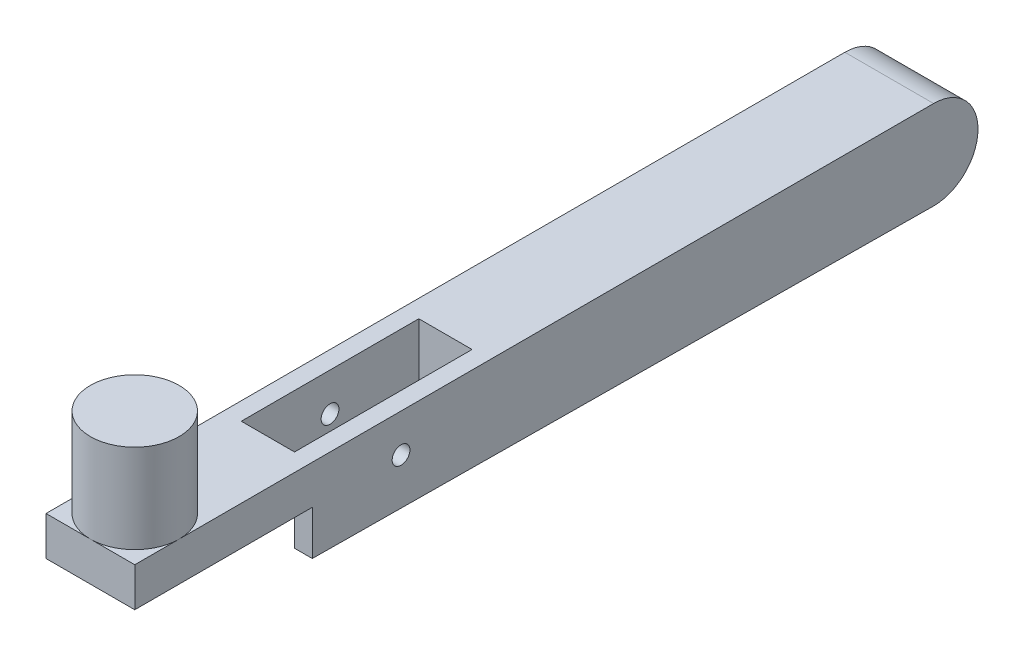
ISO-10303-21;
HEADER;
FILE_DESCRIPTION(('STEP AP214'),'2;1');
FILE_NAME('part.step','',(''),(''),'','','');
FILE_SCHEMA(('AUTOMOTIVE_DESIGN { 1 0 10303 214 1 1 1 1 }'));
ENDSEC;
DATA;
#1=APPLICATION_CONTEXT('core data for automotive mechanical design processes');
#2=APPLICATION_PROTOCOL_DEFINITION('international standard','automotive_design',2000,#1);
#3=PRODUCT_CONTEXT('',#1,'mechanical');
#4=PRODUCT('Part','Part','',(#3));
#5=PRODUCT_RELATED_PRODUCT_CATEGORY('part','',(#4));
#6=PRODUCT_DEFINITION_FORMATION('','',#4);
#7=PRODUCT_DEFINITION_CONTEXT('part definition',#1,'design');
#8=PRODUCT_DEFINITION('design','',#6,#7);
#9=PRODUCT_DEFINITION_SHAPE('','',#8);
#10=(LENGTH_UNIT() NAMED_UNIT(*) SI_UNIT(.MILLI.,.METRE.));
#11=(NAMED_UNIT(*) PLANE_ANGLE_UNIT() SI_UNIT($,.RADIAN.));
#12=(NAMED_UNIT(*) SI_UNIT($,.STERADIAN.) SOLID_ANGLE_UNIT());
#13=UNCERTAINTY_MEASURE_WITH_UNIT(LENGTH_MEASURE(1.E-05),#10,'distance_accuracy_value','');
#14=(GEOMETRIC_REPRESENTATION_CONTEXT(3) GLOBAL_UNCERTAINTY_ASSIGNED_CONTEXT((#13)) GLOBAL_UNIT_ASSIGNED_CONTEXT((#10,
#11,#12)) REPRESENTATION_CONTEXT('',''));
#15=CARTESIAN_POINT('',(0.,0.,0.));
#16=DIRECTION('',(0.,0.,1.));
#17=DIRECTION('',(1.,0.,0.));
#18=AXIS2_PLACEMENT_3D('',#15,#16,#17);
#19=CARTESIAN_POINT('',(50.,0.,209.888268156425));
#20=DIRECTION('',(0.,0.,1.));
#21=DIRECTION('',(1.,0.,0.));
#22=AXIS2_PLACEMENT_3D('',#19,#20,#21);
#23=PLANE('',#22);
#24=DIRECTION('',(0.,-1.,0.));
#25=VECTOR('',#24,1.);
#26=CARTESIAN_POINT('',(10.,0.,209.888268156425));
#27=LINE('',#26,#25);
#28=CARTESIAN_POINT('',(10.,13.4357541899441,209.888268156425));
#29=VERTEX_POINT('',#28);
#30=CARTESIAN_POINT('',(10.,-11.5642458100559,209.888268156425));
#31=VERTEX_POINT('',#30);
#32=EDGE_CURVE('E51',#29,#31,#27,.T.);
#33=ORIENTED_EDGE('',*,*,#32,.F.);
#34=DIRECTION('',(-1.,0.,0.));
#35=VECTOR('',#34,1.);
#36=CARTESIAN_POINT('',(50.,13.4357541899441,209.888268156425));
#37=LINE('',#36,#35);
#38=CARTESIAN_POINT('',(0.,13.4357541899441,209.888268156425));
#39=VERTEX_POINT('',#38);
#40=EDGE_CURVE('E240',#29,#39,#37,.T.);
#41=ORIENTED_EDGE('',*,*,#40,.T.);
#42=DIRECTION('',(0.,1.,0.));
#43=VECTOR('',#42,1.);
#44=CARTESIAN_POINT('',(0.,0.,209.888268156425));
#45=LINE('',#44,#43);
#46=CARTESIAN_POINT('',(0.,-11.5642458100559,209.888268156425));
#47=VERTEX_POINT('',#46);
#48=EDGE_CURVE('E191',#47,#39,#45,.T.);
#49=ORIENTED_EDGE('',*,*,#48,.F.);
#50=DIRECTION('',(-1.,0.,0.));
#51=VECTOR('',#50,1.);
#52=CARTESIAN_POINT('',(50.,-11.5642458100559,209.888268156425));
#53=LINE('',#52,#51);
#54=EDGE_CURVE('E212',#31,#47,#53,.T.);
#55=ORIENTED_EDGE('',*,*,#54,.F.);
#56=EDGE_LOOP('',(#33,#41,#49,#55));
#57=FACE_BOUND('',#56,.T.);
#58=ADVANCED_FACE('F41',(#57),#23,.T.);
#59=CARTESIAN_POINT('',(50.,35.4189944134078,0.));
#60=DIRECTION('',(0.,1.,0.));
#61=DIRECTION('',(0.,0.,1.));
#62=AXIS2_PLACEMENT_3D('',#59,#60,#61);
#63=PLANE('',#62);
#64=DIRECTION('',(-1.,0.,0.));
#65=VECTOR('',#64,1.);
#66=CARTESIAN_POINT('',(50.,35.4189944134078,309.888268156425));
#67=LINE('',#66,#65);
#68=CARTESIAN_POINT('',(25.,35.4189944134078,309.888268156425));
#69=VERTEX_POINT('',#68);
#70=CARTESIAN_POINT('',(0.,35.4189944134078,309.888268156425));
#71=VERTEX_POINT('',#70);
#72=EDGE_CURVE('E249',#69,#71,#67,.T.);
#73=ORIENTED_EDGE('',*,*,#72,.F.);
#74=CARTESIAN_POINT('',(25.,35.4189944134078,284.888268156425));
#75=DIRECTION('',(0.,1.,0.));
#76=DIRECTION('',(0.,0.,1.));
#77=AXIS2_PLACEMENT_3D('',#74,#75,#76);
#78=CIRCLE('',#77,25.);
#79=CARTESIAN_POINT('',(0.,35.4189944134078,284.888268156425));
#80=VERTEX_POINT('',#79);
#81=EDGE_CURVE('E176',#80,#69,#78,.T.);
#82=ORIENTED_EDGE('',*,*,#81,.F.);
#83=DIRECTION('',(0.,0.,-1.));
#84=VECTOR('',#83,1.);
#85=CARTESIAN_POINT('',(0.,35.4189944134078,0.));
#86=LINE('',#85,#84);
#87=EDGE_CURVE('E221',#71,#80,#86,.T.);
#88=ORIENTED_EDGE('',*,*,#87,.F.);
#89=EDGE_LOOP('',(#73,#82,#88));
#90=FACE_BOUND('',#89,.T.);
#91=ADVANCED_FACE('F293',(#90),#63,.T.);
#92=DIRECTION('',(0.,0.,1.));
#93=VECTOR('',#92,1.);
#94=CARTESIAN_POINT('',(10.,35.4189944134078,109.888268156425));
#95=LINE('',#94,#93);
#96=CARTESIAN_POINT('',(10.,35.4189944134078,109.888268156425));
#97=VERTEX_POINT('',#96);
#98=CARTESIAN_POINT('',(10.,35.4189944134078,209.888268156425));
#99=VERTEX_POINT('',#98);
#100=EDGE_CURVE('E58',#97,#99,#95,.T.);
#101=ORIENTED_EDGE('',*,*,#100,.F.);
#102=DIRECTION('',(-1.,0.,0.));
#103=VECTOR('',#102,1.);
#104=CARTESIAN_POINT('',(10.,35.4189944134078,109.888268156425));
#105=LINE('',#104,#103);
#106=CARTESIAN_POINT('',(40.,35.4189944134078,109.888268156425));
#107=VERTEX_POINT('',#106);
#108=EDGE_CURVE('E157',#107,#97,#105,.T.);
#109=ORIENTED_EDGE('',*,*,#108,.F.);
#110=DIRECTION('',(0.,0.,-1.));
#111=VECTOR('',#110,1.);
#112=CARTESIAN_POINT('',(40.,35.4189944134078,109.888268156425));
#113=LINE('',#112,#111);
#114=CARTESIAN_POINT('',(40.,35.4189944134078,209.888268156425));
#115=VERTEX_POINT('',#114);
#116=EDGE_CURVE('E139',#115,#107,#113,.T.);
#117=ORIENTED_EDGE('',*,*,#116,.F.);
#118=DIRECTION('',(1.,0.,0.));
#119=VECTOR('',#118,1.);
#120=CARTESIAN_POINT('',(10.,35.4189944134078,209.888268156425));
#121=LINE('',#120,#119);
#122=EDGE_CURVE('E149',#99,#115,#121,.T.);
#123=ORIENTED_EDGE('',*,*,#122,.F.);
#124=EDGE_LOOP('',(#101,#109,#117,#123));
#125=FACE_BOUND('',#124,.T.);
#126=CARTESIAN_POINT('',(0.,35.4189944134078,-140.111731843575));
#127=VERTEX_POINT('',#126);
#128=EDGE_CURVE('E220',#80,#127,#86,.T.);
#129=ORIENTED_EDGE('',*,*,#128,.F.);
#130=CARTESIAN_POINT('',(50.,35.4189944134078,284.888268156425));
#131=VERTEX_POINT('',#130);
#132=EDGE_CURVE('E185',#131,#80,#78,.T.);
#133=ORIENTED_EDGE('',*,*,#132,.F.);
#134=DIRECTION('',(0.,0.,-1.));
#135=VECTOR('',#134,1.);
#136=CARTESIAN_POINT('',(50.,35.4189944134078,0.));
#137=LINE('',#136,#135);
#138=CARTESIAN_POINT('',(50.,35.4189944134078,-140.111731843575));
#139=VERTEX_POINT('',#138);
#140=EDGE_CURVE('E195',#131,#139,#137,.T.);
#141=ORIENTED_EDGE('',*,*,#140,.T.);
#142=DIRECTION('',(-1.,0.,0.));
#143=VECTOR('',#142,1.);
#144=CARTESIAN_POINT('',(50.,35.4189944134078,-140.111731843575));
#145=LINE('',#144,#143);
#146=EDGE_CURVE('E254',#139,#127,#145,.T.);
#147=ORIENTED_EDGE('',*,*,#146,.T.);
#148=EDGE_LOOP('',(#129,#133,#141,#147));
#149=FACE_BOUND('',#148,.T.);
#150=ADVANCED_FACE('F154',(#125,#149),#63,.T.);
#151=CARTESIAN_POINT('',(50.,-13.3723451583148,0.115260437118755));
#152=DIRECTION('',(0.,-0.999962855785767,0.00861899348961394));
#153=DIRECTION('',(0.,-0.00861899348961394,-0.999962855785767));
#154=AXIS2_PLACEMENT_3D('',#151,#152,#153);
#155=PLANE('',#154);
#156=DIRECTION('',(0.,-0.00861899348961394,-0.999962855785767));
#157=VECTOR('',#156,1.);
#158=CARTESIAN_POINT('',(9.99999999999999,-13.3723451583148,0.115260437118761));
#159=LINE('',#158,#157);
#160=CARTESIAN_POINT('',(10.,-12.4261771747805,109.888268156425));
#161=VERTEX_POINT('',#160);
#162=EDGE_CURVE('E173',#31,#161,#159,.T.);
#163=ORIENTED_EDGE('',*,*,#162,.F.);
#164=ORIENTED_EDGE('',*,*,#54,.T.);
#165=DIRECTION('',(0.,0.00861899348961394,0.999962855785767));
#166=VECTOR('',#165,1.);
#167=CARTESIAN_POINT('',(0.,-13.3723451583148,0.115260437118755));
#168=LINE('',#167,#166);
#169=CARTESIAN_POINT('',(0.,-14.5810055865922,-140.111731843575));
#170=VERTEX_POINT('',#169);
#171=EDGE_CURVE('E181',#170,#47,#168,.T.);
#172=ORIENTED_EDGE('',*,*,#171,.F.);
#173=DIRECTION('',(-1.,0.,0.));
#174=VECTOR('',#173,1.);
#175=CARTESIAN_POINT('',(50.,-14.5810055865922,-140.111731843575));
#176=LINE('',#175,#174);
#177=CARTESIAN_POINT('',(50.,-14.5810055865922,-140.111731843575));
#178=VERTEX_POINT('',#177);
#179=EDGE_CURVE('E258',#178,#170,#176,.T.);
#180=ORIENTED_EDGE('',*,*,#179,.F.);
#181=DIRECTION('',(0.,0.00861899348961394,0.999962855785767));
#182=VECTOR('',#181,1.);
#183=CARTESIAN_POINT('',(50.,-13.3723451583148,0.115260437118755));
#184=LINE('',#183,#182);
#185=CARTESIAN_POINT('',(50.,-11.5642458100559,209.888268156425));
#186=VERTEX_POINT('',#185);
#187=EDGE_CURVE('E186',#178,#186,#184,.T.);
#188=ORIENTED_EDGE('',*,*,#187,.T.);
#189=CARTESIAN_POINT('',(40.,-11.5642458100559,209.888268156425));
#190=VERTEX_POINT('',#189);
#191=EDGE_CURVE('E236',#186,#190,#53,.T.);
#192=ORIENTED_EDGE('',*,*,#191,.T.);
#193=DIRECTION('',(0.,0.00861899348961394,0.999962855785767));
#194=VECTOR('',#193,1.);
#195=CARTESIAN_POINT('',(40.,-13.3723451583148,0.115260437118757));
#196=LINE('',#195,#194);
#197=CARTESIAN_POINT('',(40.,-12.4261771747805,109.888268156425));
#198=VERTEX_POINT('',#197);
#199=EDGE_CURVE('E66',#198,#190,#196,.T.);
#200=ORIENTED_EDGE('',*,*,#199,.F.);
#201=DIRECTION('',(1.,0.,0.));
#202=VECTOR('',#201,1.);
#203=CARTESIAN_POINT('',(50.,-12.4261771747805,109.888268156425));
#204=LINE('',#203,#202);
#205=EDGE_CURVE('E11',#161,#198,#204,.T.);
#206=ORIENTED_EDGE('',*,*,#205,.F.);
#207=EDGE_LOOP('',(#163,#164,#172,#180,#188,#192,#200,#206));
#208=FACE_BOUND('',#207,.T.);
#209=ADVANCED_FACE('F43',(#208),#155,.T.);
#210=CARTESIAN_POINT('',(50.,10.4189944134078,-140.111731843575));
#211=DIRECTION('',(-1.,0.,0.));
#212=DIRECTION('',(0.,0.,1.));
#213=AXIS2_PLACEMENT_3D('',#210,#211,#212);
#214=CYLINDRICAL_SURFACE('',#213,25.);
#215=CARTESIAN_POINT('',(0.,10.4189944134078,-140.111731843575));
#216=DIRECTION('',(1.,0.,0.));
#217=DIRECTION('',(0.,0.,-1.));
#218=AXIS2_PLACEMENT_3D('',#215,#216,#217);
#219=CIRCLE('',#218,25.);
#220=EDGE_CURVE('E216',#170,#127,#219,.T.);
#221=ORIENTED_EDGE('',*,*,#220,.T.);
#222=ORIENTED_EDGE('',*,*,#146,.F.);
#223=CARTESIAN_POINT('',(50.,10.4189944134078,-140.111731843575));
#224=DIRECTION('',(1.,0.,0.));
#225=DIRECTION('',(0.,0.,-1.));
#226=AXIS2_PLACEMENT_3D('',#223,#224,#225);
#227=CIRCLE('',#226,25.);
#228=EDGE_CURVE('E190',#178,#139,#227,.T.);
#229=ORIENTED_EDGE('',*,*,#228,.F.);
#230=ORIENTED_EDGE('',*,*,#179,.T.);
#231=EDGE_LOOP('',(#221,#222,#229,#230));
#232=FACE_BOUND('',#231,.T.);
#233=ADVANCED_FACE('F314',(#232),#214,.T.);
#234=CARTESIAN_POINT('',(50.,35.4189944134078,309.888268156425));
#235=VERTEX_POINT('',#234);
#236=EDGE_CURVE('E196',#235,#131,#137,.T.);
#237=ORIENTED_EDGE('',*,*,#236,.T.);
#238=EDGE_CURVE('E182',#69,#131,#78,.T.);
#239=ORIENTED_EDGE('',*,*,#238,.F.);
#240=EDGE_CURVE('E250',#235,#69,#67,.T.);
#241=ORIENTED_EDGE('',*,*,#240,.F.);
#242=EDGE_LOOP('',(#237,#239,#241));
#243=FACE_BOUND('',#242,.T.);
#244=ADVANCED_FACE('F291',(#243),#63,.T.);
#245=CARTESIAN_POINT('',(50.,0.,309.888268156425));
#246=DIRECTION('',(0.,0.,1.));
#247=DIRECTION('',(1.,0.,0.));
#248=AXIS2_PLACEMENT_3D('',#245,#246,#247);
#249=PLANE('',#248);
#250=DIRECTION('',(0.,1.,0.));
#251=VECTOR('',#250,1.);
#252=CARTESIAN_POINT('',(0.,0.,309.888268156425));
#253=LINE('',#252,#251);
#254=CARTESIAN_POINT('',(0.,13.4357541899441,309.888268156425));
#255=VERTEX_POINT('',#254);
#256=EDGE_CURVE('E225',#255,#71,#253,.T.);
#257=ORIENTED_EDGE('',*,*,#256,.F.);
#258=DIRECTION('',(-1.,0.,0.));
#259=VECTOR('',#258,1.);
#260=CARTESIAN_POINT('',(50.,13.4357541899441,309.888268156425));
#261=LINE('',#260,#259);
#262=CARTESIAN_POINT('',(50.,13.4357541899441,309.888268156425));
#263=VERTEX_POINT('',#262);
#264=EDGE_CURVE('E245',#263,#255,#261,.T.);
#265=ORIENTED_EDGE('',*,*,#264,.F.);
#266=DIRECTION('',(0.,1.,0.));
#267=VECTOR('',#266,1.);
#268=CARTESIAN_POINT('',(50.,0.,309.888268156425));
#269=LINE('',#268,#267);
#270=EDGE_CURVE('E200',#263,#235,#269,.T.);
#271=ORIENTED_EDGE('',*,*,#270,.T.);
#272=ORIENTED_EDGE('',*,*,#240,.T.);
#273=ORIENTED_EDGE('',*,*,#72,.T.);
#274=EDGE_LOOP('',(#257,#265,#271,#272,#273));
#275=FACE_BOUND('',#274,.T.);
#276=ADVANCED_FACE('F297',(#275),#249,.T.);
#277=CARTESIAN_POINT('',(50.,13.4357541899442,0.));
#278=DIRECTION('',(0.,-1.,0.));
#279=DIRECTION('',(0.,0.,-1.));
#280=AXIS2_PLACEMENT_3D('',#277,#278,#279);
#281=PLANE('',#280);
#282=DIRECTION('',(0.,0.,1.));
#283=VECTOR('',#282,1.);
#284=CARTESIAN_POINT('',(0.,13.4357541899442,0.));
#285=LINE('',#284,#283);
#286=EDGE_CURVE('E229',#39,#255,#285,.T.);
#287=ORIENTED_EDGE('',*,*,#286,.F.);
#288=ORIENTED_EDGE('',*,*,#40,.F.);
#289=CARTESIAN_POINT('',(40.,13.4357541899441,209.888268156425));
#290=VERTEX_POINT('',#289);
#291=EDGE_CURVE('E246',#290,#29,#37,.T.);
#292=ORIENTED_EDGE('',*,*,#291,.F.);
#293=CARTESIAN_POINT('',(50.,13.4357541899441,209.888268156425));
#294=VERTEX_POINT('',#293);
#295=EDGE_CURVE('E241',#294,#290,#37,.T.);
#296=ORIENTED_EDGE('',*,*,#295,.F.);
#297=DIRECTION('',(0.,0.,1.));
#298=VECTOR('',#297,1.);
#299=CARTESIAN_POINT('',(50.,13.4357541899442,0.));
#300=LINE('',#299,#298);
#301=EDGE_CURVE('E204',#294,#263,#300,.T.);
#302=ORIENTED_EDGE('',*,*,#301,.T.);
#303=ORIENTED_EDGE('',*,*,#264,.T.);
#304=EDGE_LOOP('',(#287,#288,#292,#296,#302,#303));
#305=FACE_BOUND('',#304,.T.);
#306=ADVANCED_FACE('F307',(#305),#281,.T.);
#307=DIRECTION('',(0.,1.,0.));
#308=VECTOR('',#307,1.);
#309=CARTESIAN_POINT('',(40.,0.,209.888268156425));
#310=LINE('',#309,#308);
#311=EDGE_CURVE('E141',#190,#290,#310,.T.);
#312=ORIENTED_EDGE('',*,*,#311,.F.);
#313=ORIENTED_EDGE('',*,*,#191,.F.);
#314=DIRECTION('',(0.,1.,0.));
#315=VECTOR('',#314,1.);
#316=CARTESIAN_POINT('',(50.,0.,209.888268156425));
#317=LINE('',#316,#315);
#318=EDGE_CURVE('E208',#186,#294,#317,.T.);
#319=ORIENTED_EDGE('',*,*,#318,.T.);
#320=ORIENTED_EDGE('',*,*,#295,.T.);
#321=EDGE_LOOP('',(#312,#313,#319,#320));
#322=FACE_BOUND('',#321,.T.);
#323=ADVANCED_FACE('F309',(#322),#23,.T.);
#324=CARTESIAN_POINT('',(50.,0.,0.));
#325=DIRECTION('',(1.,0.,0.));
#326=DIRECTION('',(0.,0.,-1.));
#327=AXIS2_PLACEMENT_3D('',#324,#325,#326);
#328=PLANE('',#327);
#329=CARTESIAN_POINT('',(50.,13.9451269071097,159.888268156425));
#330=DIRECTION('',(1.,0.,0.));
#331=DIRECTION('',(0.,0.,-1.));
#332=AXIS2_PLACEMENT_3D('',#329,#330,#331);
#333=CIRCLE('',#332,4.99999999999999);
#334=CARTESIAN_POINT('',(50.,13.9451269071097,154.888268156425));
#335=VERTEX_POINT('',#334);
#336=EDGE_CURVE('E468',#335,#335,#333,.T.);
#337=ORIENTED_EDGE('',*,*,#336,.F.);
#338=EDGE_LOOP('',(#337));
#339=FACE_BOUND('',#338,.T.);
#340=ORIENTED_EDGE('',*,*,#187,.F.);
#341=ORIENTED_EDGE('',*,*,#228,.T.);
#342=ORIENTED_EDGE('',*,*,#140,.F.);
#343=ORIENTED_EDGE('',*,*,#236,.F.);
#344=ORIENTED_EDGE('',*,*,#270,.F.);
#345=ORIENTED_EDGE('',*,*,#301,.F.);
#346=ORIENTED_EDGE('',*,*,#318,.F.);
#347=EDGE_LOOP('',(#340,#341,#342,#343,#344,#345,#346));
#348=FACE_BOUND('',#347,.T.);
#349=ADVANCED_FACE('F302',(#339,#348),#328,.T.);
#350=CARTESIAN_POINT('',(0.,0.,0.));
#351=DIRECTION('',(1.,0.,0.));
#352=DIRECTION('',(0.,0.,-1.));
#353=AXIS2_PLACEMENT_3D('',#350,#351,#352);
#354=PLANE('',#353);
#355=CARTESIAN_POINT('',(0.,13.9451269071097,159.888268156425));
#356=DIRECTION('',(1.,0.,0.));
#357=DIRECTION('',(0.,0.,-1.));
#358=AXIS2_PLACEMENT_3D('',#355,#356,#357);
#359=CIRCLE('',#358,4.99999999999999);
#360=CARTESIAN_POINT('',(0.,13.9451269071097,154.888268156425));
#361=VERTEX_POINT('',#360);
#362=EDGE_CURVE('E458',#361,#361,#359,.T.);
#363=ORIENTED_EDGE('',*,*,#362,.T.);
#364=EDGE_LOOP('',(#363));
#365=FACE_BOUND('',#364,.T.);
#366=ORIENTED_EDGE('',*,*,#171,.T.);
#367=ORIENTED_EDGE('',*,*,#48,.T.);
#368=ORIENTED_EDGE('',*,*,#286,.T.);
#369=ORIENTED_EDGE('',*,*,#256,.T.);
#370=ORIENTED_EDGE('',*,*,#87,.T.);
#371=ORIENTED_EDGE('',*,*,#128,.T.);
#372=ORIENTED_EDGE('',*,*,#220,.F.);
#373=EDGE_LOOP('',(#366,#367,#368,#369,#370,#371,#372));
#374=FACE_BOUND('',#373,.T.);
#375=ADVANCED_FACE('F316',(#365,#374),#354,.F.);
#376=CARTESIAN_POINT('',(25.,85.4189944134078,284.888268156425));
#377=DIRECTION('',(0.,-1.,0.));
#378=DIRECTION('',(0.,0.,-1.));
#379=AXIS2_PLACEMENT_3D('',#376,#377,#378);
#380=CYLINDRICAL_SURFACE('',#379,25.);
#381=CARTESIAN_POINT('',(25.,85.4189944134078,284.888268156425));
#382=DIRECTION('',(0.,1.,0.));
#383=DIRECTION('',(0.,0.,1.));
#384=AXIS2_PLACEMENT_3D('',#381,#382,#383);
#385=CIRCLE('',#384,25.);
#386=CARTESIAN_POINT('',(25.,85.4189944134078,309.888268156425));
#387=VERTEX_POINT('',#386);
#388=EDGE_CURVE('E177',#387,#387,#385,.T.);
#389=ORIENTED_EDGE('',*,*,#388,.F.);
#390=EDGE_LOOP('',(#389));
#391=FACE_BOUND('',#390,.T.);
#392=ORIENTED_EDGE('',*,*,#238,.T.);
#393=ORIENTED_EDGE('',*,*,#132,.T.);
#394=ORIENTED_EDGE('',*,*,#81,.T.);
#395=EDGE_LOOP('',(#392,#393,#394));
#396=FACE_BOUND('',#395,.T.);
#397=ADVANCED_FACE('F284',(#391,#396),#380,.T.);
#398=CARTESIAN_POINT('',(25.,85.4189944134078,284.888268156425));
#399=DIRECTION('',(0.,1.,0.));
#400=DIRECTION('',(0.,0.,1.));
#401=AXIS2_PLACEMENT_3D('',#398,#399,#400);
#402=PLANE('',#401);
#403=ORIENTED_EDGE('',*,*,#388,.T.);
#404=EDGE_LOOP('',(#403));
#405=FACE_BOUND('',#404,.T.);
#406=ADVANCED_FACE('F325',(#405),#402,.T.);
#407=CARTESIAN_POINT('',(10.,-14.5810055865922,109.888268156425));
#408=DIRECTION('',(-1.,0.,0.));
#409=DIRECTION('',(0.,0.,1.));
#410=AXIS2_PLACEMENT_3D('',#407,#408,#409);
#411=PLANE('',#410);
#412=CARTESIAN_POINT('',(10.,13.9451269071097,159.888268156425));
#413=DIRECTION('',(-1.,0.,0.));
#414=DIRECTION('',(0.,0.,1.));
#415=AXIS2_PLACEMENT_3D('',#412,#413,#414);
#416=CIRCLE('',#415,4.99999999999999);
#417=CARTESIAN_POINT('',(10.,13.9451269071097,164.888268156425));
#418=VERTEX_POINT('',#417);
#419=EDGE_CURVE('E461',#418,#418,#416,.T.);
#420=ORIENTED_EDGE('',*,*,#419,.T.);
#421=EDGE_LOOP('',(#420));
#422=FACE_BOUND('',#421,.T.);
#423=ORIENTED_EDGE('',*,*,#162,.T.);
#424=DIRECTION('',(0.,1.,0.));
#425=VECTOR('',#424,1.);
#426=CARTESIAN_POINT('',(10.,-14.5810055865922,109.888268156425));
#427=LINE('',#426,#425);
#428=EDGE_CURVE('E164',#161,#97,#427,.T.);
#429=ORIENTED_EDGE('',*,*,#428,.T.);
#430=ORIENTED_EDGE('',*,*,#100,.T.);
#431=DIRECTION('',(0.,1.,0.));
#432=VECTOR('',#431,1.);
#433=CARTESIAN_POINT('',(10.,-14.5810055865922,209.888268156425));
#434=LINE('',#433,#432);
#435=EDGE_CURVE('E146',#29,#99,#434,.T.);
#436=ORIENTED_EDGE('',*,*,#435,.F.);
#437=ORIENTED_EDGE('',*,*,#32,.T.);
#438=EDGE_LOOP('',(#423,#429,#430,#436,#437));
#439=FACE_BOUND('',#438,.T.);
#440=ADVANCED_FACE('F266',(#422,#439),#411,.F.);
#441=CARTESIAN_POINT('',(10.,-14.5810055865922,109.888268156425));
#442=DIRECTION('',(0.,0.,-1.));
#443=DIRECTION('',(-1.,0.,0.));
#444=AXIS2_PLACEMENT_3D('',#441,#442,#443);
#445=PLANE('',#444);
#446=ORIENTED_EDGE('',*,*,#205,.T.);
#447=DIRECTION('',(0.,1.,0.));
#448=VECTOR('',#447,1.);
#449=CARTESIAN_POINT('',(40.,-14.5810055865922,109.888268156425));
#450=LINE('',#449,#448);
#451=EDGE_CURVE('E145',#198,#107,#450,.T.);
#452=ORIENTED_EDGE('',*,*,#451,.T.);
#453=ORIENTED_EDGE('',*,*,#108,.T.);
#454=ORIENTED_EDGE('',*,*,#428,.F.);
#455=EDGE_LOOP('',(#446,#452,#453,#454));
#456=FACE_BOUND('',#455,.T.);
#457=ADVANCED_FACE('F406',(#456),#445,.F.);
#458=CARTESIAN_POINT('',(40.,-14.5810055865922,109.888268156425));
#459=DIRECTION('',(1.,0.,0.));
#460=DIRECTION('',(0.,0.,-1.));
#461=AXIS2_PLACEMENT_3D('',#458,#459,#460);
#462=PLANE('',#461);
#463=CARTESIAN_POINT('',(40.,13.9451269071097,159.888268156425));
#464=DIRECTION('',(1.,0.,0.));
#465=DIRECTION('',(0.,0.,-1.));
#466=AXIS2_PLACEMENT_3D('',#463,#464,#465);
#467=CIRCLE('',#466,4.99999999999999);
#468=CARTESIAN_POINT('',(40.,13.9451269071097,154.888268156425));
#469=VERTEX_POINT('',#468);
#470=EDGE_CURVE('E45',#469,#469,#467,.T.);
#471=ORIENTED_EDGE('',*,*,#470,.T.);
#472=EDGE_LOOP('',(#471));
#473=FACE_BOUND('',#472,.T.);
#474=ORIENTED_EDGE('',*,*,#199,.T.);
#475=ORIENTED_EDGE('',*,*,#311,.T.);
#476=DIRECTION('',(0.,1.,0.));
#477=VECTOR('',#476,1.);
#478=CARTESIAN_POINT('',(40.,-14.5810055865922,209.888268156425));
#479=LINE('',#478,#477);
#480=EDGE_CURVE('E135',#290,#115,#479,.T.);
#481=ORIENTED_EDGE('',*,*,#480,.T.);
#482=ORIENTED_EDGE('',*,*,#116,.T.);
#483=ORIENTED_EDGE('',*,*,#451,.F.);
#484=EDGE_LOOP('',(#474,#475,#481,#482,#483));
#485=FACE_BOUND('',#484,.T.);
#486=ADVANCED_FACE('F137',(#473,#485),#462,.F.);
#487=CARTESIAN_POINT('',(10.,-14.5810055865922,209.888268156425));
#488=DIRECTION('',(0.,0.,1.));
#489=DIRECTION('',(1.,0.,0.));
#490=AXIS2_PLACEMENT_3D('',#487,#488,#489);
#491=PLANE('',#490);
#492=ORIENTED_EDGE('',*,*,#291,.T.);
#493=ORIENTED_EDGE('',*,*,#435,.T.);
#494=ORIENTED_EDGE('',*,*,#122,.T.);
#495=ORIENTED_EDGE('',*,*,#480,.F.);
#496=EDGE_LOOP('',(#492,#493,#494,#495));
#497=FACE_BOUND('',#496,.T.);
#498=ADVANCED_FACE('F150',(#497),#491,.F.);
#499=CARTESIAN_POINT('',(0.,13.9451269071097,159.888268156425));
#500=DIRECTION('',(1.,0.,0.));
#501=DIRECTION('',(0.,0.,-1.));
#502=AXIS2_PLACEMENT_3D('',#499,#500,#501);
#503=CYLINDRICAL_SURFACE('',#502,4.99999999999999);
#504=ORIENTED_EDGE('',*,*,#336,.T.);
#505=EDGE_LOOP('',(#504));
#506=FACE_BOUND('',#505,.T.);
#507=ORIENTED_EDGE('',*,*,#470,.F.);
#508=EDGE_LOOP('',(#507));
#509=FACE_BOUND('',#508,.T.);
#510=ADVANCED_FACE('F432',(#506,#509),#503,.F.);
#511=ORIENTED_EDGE('',*,*,#362,.F.);
#512=EDGE_LOOP('',(#511));
#513=FACE_BOUND('',#512,.T.);
#514=ORIENTED_EDGE('',*,*,#419,.F.);
#515=EDGE_LOOP('',(#514));
#516=FACE_BOUND('',#515,.T.);
#517=ADVANCED_FACE('F440',(#513,#516),#503,.F.);
#518=CLOSED_SHELL('',(#58,#91,#150,#209,#233,#244,#276,#306,#323,#349,#375,#397,#406,#440,#457,
#486,#498,#510,#517));
#519=MANIFOLD_SOLID_BREP('B2',#518);
#520=ADVANCED_BREP_SHAPE_REPRESENTATION('',(#18,#519),#14);
#521=SHAPE_DEFINITION_REPRESENTATION(#9,#520);
ENDSEC;
END-ISO-10303-21;
